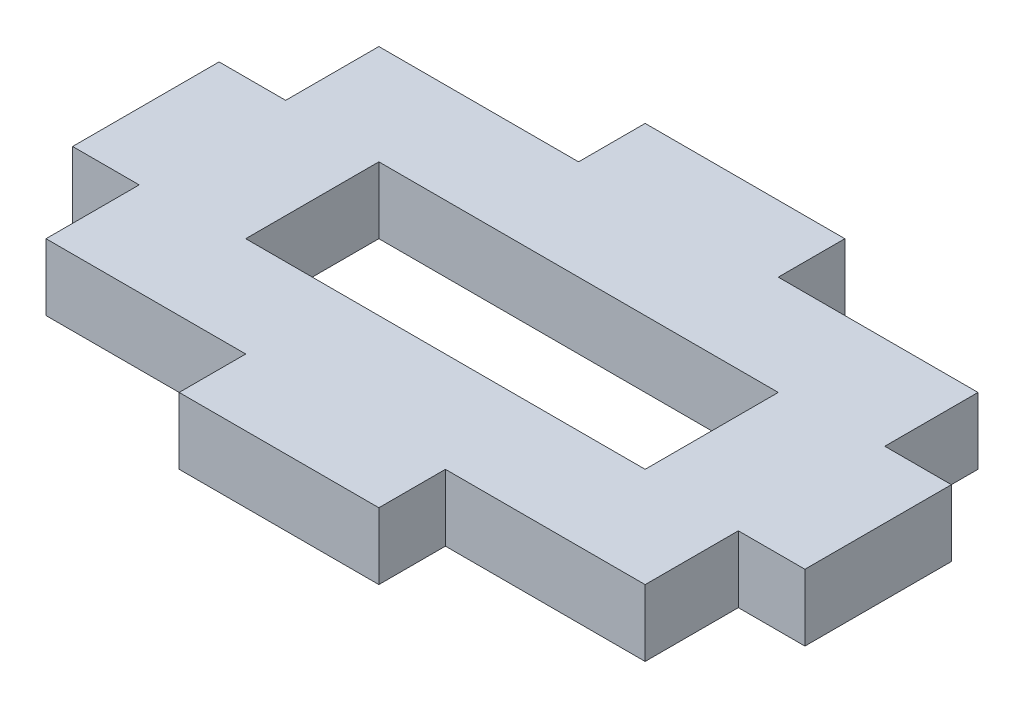
ISO-10303-21;
HEADER;
FILE_DESCRIPTION(('STEP AP214'),'2;1');
FILE_NAME('part.step','',(''),(''),'','','');
FILE_SCHEMA(('AUTOMOTIVE_DESIGN { 1 0 10303 214 1 1 1 1 }'));
ENDSEC;
DATA;
#1=APPLICATION_CONTEXT('core data for automotive mechanical design processes');
#2=APPLICATION_PROTOCOL_DEFINITION('international standard','automotive_design',2000,#1);
#3=PRODUCT_CONTEXT('',#1,'mechanical');
#4=PRODUCT('Part','Part','',(#3));
#5=PRODUCT_RELATED_PRODUCT_CATEGORY('part','',(#4));
#6=PRODUCT_DEFINITION_FORMATION('','',#4);
#7=PRODUCT_DEFINITION_CONTEXT('part definition',#1,'design');
#8=PRODUCT_DEFINITION('design','',#6,#7);
#9=PRODUCT_DEFINITION_SHAPE('','',#8);
#10=(LENGTH_UNIT() NAMED_UNIT(*) SI_UNIT(.MILLI.,.METRE.));
#11=(NAMED_UNIT(*) PLANE_ANGLE_UNIT() SI_UNIT($,.RADIAN.));
#12=(NAMED_UNIT(*) SI_UNIT($,.STERADIAN.) SOLID_ANGLE_UNIT());
#13=UNCERTAINTY_MEASURE_WITH_UNIT(LENGTH_MEASURE(1.E-05),#10,'distance_accuracy_value','');
#14=(GEOMETRIC_REPRESENTATION_CONTEXT(3) GLOBAL_UNCERTAINTY_ASSIGNED_CONTEXT((#13)) GLOBAL_UNIT_ASSIGNED_CONTEXT((#10,
#11,#12)) REPRESENTATION_CONTEXT('',''));
#15=CARTESIAN_POINT('',(0.,0.,0.));
#16=DIRECTION('',(0.,0.,1.));
#17=DIRECTION('',(1.,0.,0.));
#18=AXIS2_PLACEMENT_3D('',#15,#16,#17);
#19=CARTESIAN_POINT('',(0.,5.,0.));
#20=DIRECTION('',(0.,-1.,0.));
#21=DIRECTION('',(0.,0.,-1.));
#22=AXIS2_PLACEMENT_3D('',#19,#20,#21);
#23=PLANE('',#22);
#24=DIRECTION('',(0.,0.,-1.));
#25=VECTOR('',#24,1.);
#26=CARTESIAN_POINT('',(22.5,5.,-5.5));
#27=LINE('',#26,#25);
#28=CARTESIAN_POINT('',(22.5,5.,-5.5));
#29=VERTEX_POINT('',#28);
#30=CARTESIAN_POINT('',(22.5,5.,-12.5));
#31=VERTEX_POINT('',#30);
#32=EDGE_CURVE('E230',#29,#31,#27,.T.);
#33=ORIENTED_EDGE('',*,*,#32,.T.);
#34=DIRECTION('',(-1.,0.,0.));
#35=VECTOR('',#34,1.);
#36=CARTESIAN_POINT('',(7.5,5.,-12.5));
#37=LINE('',#36,#35);
#38=CARTESIAN_POINT('',(7.5,5.,-12.5));
#39=VERTEX_POINT('',#38);
#40=EDGE_CURVE('E233',#31,#39,#37,.T.);
#41=ORIENTED_EDGE('',*,*,#40,.T.);
#42=DIRECTION('',(0.,0.,-1.));
#43=VECTOR('',#42,1.);
#44=CARTESIAN_POINT('',(7.5,5.,-12.5));
#45=LINE('',#44,#43);
#46=CARTESIAN_POINT('',(7.50000000000001,5.,-17.5));
#47=VERTEX_POINT('',#46);
#48=EDGE_CURVE('E236',#39,#47,#45,.T.);
#49=ORIENTED_EDGE('',*,*,#48,.T.);
#50=DIRECTION('',(-1.,0.,0.));
#51=VECTOR('',#50,1.);
#52=CARTESIAN_POINT('',(-7.49999999999999,5.,-17.5));
#53=LINE('',#52,#51);
#54=CARTESIAN_POINT('',(-7.49999999999999,5.,-17.5));
#55=VERTEX_POINT('',#54);
#56=EDGE_CURVE('E238',#47,#55,#53,.T.);
#57=ORIENTED_EDGE('',*,*,#56,.T.);
#58=DIRECTION('',(0.,0.,1.));
#59=VECTOR('',#58,1.);
#60=CARTESIAN_POINT('',(-7.5,5.,-12.5));
#61=LINE('',#60,#59);
#62=CARTESIAN_POINT('',(-7.5,5.,-12.5));
#63=VERTEX_POINT('',#62);
#64=EDGE_CURVE('E240',#55,#63,#61,.T.);
#65=ORIENTED_EDGE('',*,*,#64,.T.);
#66=DIRECTION('',(-1.,0.,0.));
#67=VECTOR('',#66,1.);
#68=CARTESIAN_POINT('',(-22.5,5.,-12.5));
#69=LINE('',#68,#67);
#70=CARTESIAN_POINT('',(-22.5,5.,-12.5));
#71=VERTEX_POINT('',#70);
#72=EDGE_CURVE('E242',#63,#71,#69,.T.);
#73=ORIENTED_EDGE('',*,*,#72,.T.);
#74=DIRECTION('',(0.,0.,1.));
#75=VECTOR('',#74,1.);
#76=CARTESIAN_POINT('',(-22.5,5.,-5.5));
#77=LINE('',#76,#75);
#78=CARTESIAN_POINT('',(-22.5,5.,-5.5));
#79=VERTEX_POINT('',#78);
#80=EDGE_CURVE('E244',#71,#79,#77,.T.);
#81=ORIENTED_EDGE('',*,*,#80,.T.);
#82=DIRECTION('',(-1.,0.,0.));
#83=VECTOR('',#82,1.);
#84=CARTESIAN_POINT('',(-22.5,5.,-5.5));
#85=LINE('',#84,#83);
#86=CARTESIAN_POINT('',(-27.5,5.,-5.5));
#87=VERTEX_POINT('',#86);
#88=EDGE_CURVE('E246',#79,#87,#85,.T.);
#89=ORIENTED_EDGE('',*,*,#88,.T.);
#90=DIRECTION('',(0.,0.,1.));
#91=VECTOR('',#90,1.);
#92=CARTESIAN_POINT('',(-27.5,5.,-5.5));
#93=LINE('',#92,#91);
#94=CARTESIAN_POINT('',(-27.5,5.,5.5));
#95=VERTEX_POINT('',#94);
#96=EDGE_CURVE('E248',#87,#95,#93,.T.);
#97=ORIENTED_EDGE('',*,*,#96,.T.);
#98=DIRECTION('',(1.,0.,0.));
#99=VECTOR('',#98,1.);
#100=CARTESIAN_POINT('',(-22.5,5.,5.5));
#101=LINE('',#100,#99);
#102=CARTESIAN_POINT('',(-22.5,5.,5.5));
#103=VERTEX_POINT('',#102);
#104=EDGE_CURVE('E250',#95,#103,#101,.T.);
#105=ORIENTED_EDGE('',*,*,#104,.T.);
#106=DIRECTION('',(0.,0.,1.));
#107=VECTOR('',#106,1.);
#108=CARTESIAN_POINT('',(-22.5,5.,12.5));
#109=LINE('',#108,#107);
#110=CARTESIAN_POINT('',(-22.5,5.,12.5));
#111=VERTEX_POINT('',#110);
#112=EDGE_CURVE('E252',#103,#111,#109,.T.);
#113=ORIENTED_EDGE('',*,*,#112,.T.);
#114=DIRECTION('',(1.,0.,0.));
#115=VECTOR('',#114,1.);
#116=CARTESIAN_POINT('',(-22.5,5.,12.5));
#117=LINE('',#116,#115);
#118=CARTESIAN_POINT('',(-7.5,5.,12.5));
#119=VERTEX_POINT('',#118);
#120=EDGE_CURVE('E254',#111,#119,#117,.T.);
#121=ORIENTED_EDGE('',*,*,#120,.T.);
#122=DIRECTION('',(0.,0.,1.));
#123=VECTOR('',#122,1.);
#124=CARTESIAN_POINT('',(-7.5,5.,12.5));
#125=LINE('',#124,#123);
#126=CARTESIAN_POINT('',(-7.49999999999999,5.,17.5));
#127=VERTEX_POINT('',#126);
#128=EDGE_CURVE('E256',#119,#127,#125,.T.);
#129=ORIENTED_EDGE('',*,*,#128,.T.);
#130=DIRECTION('',(1.,0.,0.));
#131=VECTOR('',#130,1.);
#132=CARTESIAN_POINT('',(-7.49999999999999,5.,17.5));
#133=LINE('',#132,#131);
#134=CARTESIAN_POINT('',(7.50000000000001,5.,17.5));
#135=VERTEX_POINT('',#134);
#136=EDGE_CURVE('E258',#127,#135,#133,.T.);
#137=ORIENTED_EDGE('',*,*,#136,.T.);
#138=DIRECTION('',(0.,0.,-1.));
#139=VECTOR('',#138,1.);
#140=CARTESIAN_POINT('',(7.5,5.,12.5));
#141=LINE('',#140,#139);
#142=CARTESIAN_POINT('',(7.5,5.,12.5));
#143=VERTEX_POINT('',#142);
#144=EDGE_CURVE('E260',#135,#143,#141,.T.);
#145=ORIENTED_EDGE('',*,*,#144,.T.);
#146=DIRECTION('',(1.,0.,0.));
#147=VECTOR('',#146,1.);
#148=CARTESIAN_POINT('',(7.5,5.,12.5));
#149=LINE('',#148,#147);
#150=CARTESIAN_POINT('',(22.5,5.,12.5));
#151=VERTEX_POINT('',#150);
#152=EDGE_CURVE('E262',#143,#151,#149,.T.);
#153=ORIENTED_EDGE('',*,*,#152,.T.);
#154=DIRECTION('',(0.,0.,-1.));
#155=VECTOR('',#154,1.);
#156=CARTESIAN_POINT('',(22.5,5.,12.5));
#157=LINE('',#156,#155);
#158=CARTESIAN_POINT('',(22.5,5.,5.49999999999999));
#159=VERTEX_POINT('',#158);
#160=EDGE_CURVE('E264',#151,#159,#157,.T.);
#161=ORIENTED_EDGE('',*,*,#160,.T.);
#162=DIRECTION('',(1.,0.,0.));
#163=VECTOR('',#162,1.);
#164=CARTESIAN_POINT('',(22.5,5.,5.49999999999999));
#165=LINE('',#164,#163);
#166=CARTESIAN_POINT('',(27.5,5.,5.49999999999999));
#167=VERTEX_POINT('',#166);
#168=EDGE_CURVE('E266',#159,#167,#165,.T.);
#169=ORIENTED_EDGE('',*,*,#168,.T.);
#170=DIRECTION('',(0.,0.,-1.));
#171=VECTOR('',#170,1.);
#172=CARTESIAN_POINT('',(27.5,5.,-5.5));
#173=LINE('',#172,#171);
#174=CARTESIAN_POINT('',(27.5,5.,-5.5));
#175=VERTEX_POINT('',#174);
#176=EDGE_CURVE('E268',#167,#175,#173,.T.);
#177=ORIENTED_EDGE('',*,*,#176,.T.);
#178=DIRECTION('',(-1.,0.,0.));
#179=VECTOR('',#178,1.);
#180=CARTESIAN_POINT('',(22.5,5.,-5.5));
#181=LINE('',#180,#179);
#182=EDGE_CURVE('E270',#175,#29,#181,.T.);
#183=ORIENTED_EDGE('',*,*,#182,.T.);
#184=EDGE_LOOP('',(#33,#41,#49,#57,#65,#73,#81,#89,#97,#105,#113,#121,#129,#137,#145,#153,#161,
#169,#177,#183));
#185=FACE_BOUND('',#184,.T.);
#186=DIRECTION('',(0.,0.,-1.));
#187=VECTOR('',#186,1.);
#188=CARTESIAN_POINT('',(15.,5.,5.));
#189=LINE('',#188,#187);
#190=CARTESIAN_POINT('',(15.,5.,5.));
#191=VERTEX_POINT('',#190);
#192=CARTESIAN_POINT('',(15.,5.,-5.));
#193=VERTEX_POINT('',#192);
#194=EDGE_CURVE('E194',#191,#193,#189,.T.);
#195=ORIENTED_EDGE('',*,*,#194,.F.);
#196=DIRECTION('',(1.,0.,0.));
#197=VECTOR('',#196,1.);
#198=CARTESIAN_POINT('',(-15.,5.,5.));
#199=LINE('',#198,#197);
#200=CARTESIAN_POINT('',(-15.,5.,5.));
#201=VERTEX_POINT('',#200);
#202=EDGE_CURVE('E216',#201,#191,#199,.T.);
#203=ORIENTED_EDGE('',*,*,#202,.F.);
#204=DIRECTION('',(0.,0.,1.));
#205=VECTOR('',#204,1.);
#206=CARTESIAN_POINT('',(-15.,5.,5.));
#207=LINE('',#206,#205);
#208=CARTESIAN_POINT('',(-15.,5.,-5.));
#209=VERTEX_POINT('',#208);
#210=EDGE_CURVE('E214',#209,#201,#207,.T.);
#211=ORIENTED_EDGE('',*,*,#210,.F.);
#212=DIRECTION('',(-1.,0.,0.));
#213=VECTOR('',#212,1.);
#214=CARTESIAN_POINT('',(-15.,5.,-5.));
#215=LINE('',#214,#213);
#216=EDGE_CURVE('E202',#193,#209,#215,.T.);
#217=ORIENTED_EDGE('',*,*,#216,.F.);
#218=EDGE_LOOP('',(#195,#203,#211,#217));
#219=FACE_BOUND('',#218,.T.);
#220=ADVANCED_FACE('F33',(#185,#219),#23,.F.);
#221=CARTESIAN_POINT('',(0.,0.,0.));
#222=DIRECTION('',(0.,-1.,0.));
#223=DIRECTION('',(0.,0.,-1.));
#224=AXIS2_PLACEMENT_3D('',#221,#222,#223);
#225=PLANE('',#224);
#226=DIRECTION('',(0.,0.,-1.));
#227=VECTOR('',#226,1.);
#228=CARTESIAN_POINT('',(22.5,0.,-5.5));
#229=LINE('',#228,#227);
#230=CARTESIAN_POINT('',(22.5,0.,-5.5));
#231=VERTEX_POINT('',#230);
#232=CARTESIAN_POINT('',(22.5,0.,-12.5));
#233=VERTEX_POINT('',#232);
#234=EDGE_CURVE('E210',#231,#233,#229,.T.);
#235=ORIENTED_EDGE('',*,*,#234,.F.);
#236=DIRECTION('',(-1.,0.,0.));
#237=VECTOR('',#236,1.);
#238=CARTESIAN_POINT('',(22.5,0.,-5.5));
#239=LINE('',#238,#237);
#240=CARTESIAN_POINT('',(27.5,0.,-5.5));
#241=VERTEX_POINT('',#240);
#242=EDGE_CURVE('E234',#241,#231,#239,.T.);
#243=ORIENTED_EDGE('',*,*,#242,.F.);
#244=DIRECTION('',(0.,0.,-1.));
#245=VECTOR('',#244,1.);
#246=CARTESIAN_POINT('',(27.5,0.,-5.5));
#247=LINE('',#246,#245);
#248=CARTESIAN_POINT('',(27.5,0.,5.49999999999999));
#249=VERTEX_POINT('',#248);
#250=EDGE_CURVE('E309',#249,#241,#247,.T.);
#251=ORIENTED_EDGE('',*,*,#250,.F.);
#252=DIRECTION('',(1.,0.,0.));
#253=VECTOR('',#252,1.);
#254=CARTESIAN_POINT('',(22.5,0.,5.49999999999999));
#255=LINE('',#254,#253);
#256=CARTESIAN_POINT('',(22.5,0.,5.49999999999999));
#257=VERTEX_POINT('',#256);
#258=EDGE_CURVE('E307',#257,#249,#255,.T.);
#259=ORIENTED_EDGE('',*,*,#258,.F.);
#260=DIRECTION('',(0.,0.,-1.));
#261=VECTOR('',#260,1.);
#262=CARTESIAN_POINT('',(22.5,0.,12.5));
#263=LINE('',#262,#261);
#264=CARTESIAN_POINT('',(22.5,0.,12.5));
#265=VERTEX_POINT('',#264);
#266=EDGE_CURVE('E305',#265,#257,#263,.T.);
#267=ORIENTED_EDGE('',*,*,#266,.F.);
#268=DIRECTION('',(1.,0.,0.));
#269=VECTOR('',#268,1.);
#270=CARTESIAN_POINT('',(7.5,0.,12.5));
#271=LINE('',#270,#269);
#272=CARTESIAN_POINT('',(7.5,0.,12.5));
#273=VERTEX_POINT('',#272);
#274=EDGE_CURVE('E303',#273,#265,#271,.T.);
#275=ORIENTED_EDGE('',*,*,#274,.F.);
#276=DIRECTION('',(0.,0.,-1.));
#277=VECTOR('',#276,1.);
#278=CARTESIAN_POINT('',(7.5,0.,12.5));
#279=LINE('',#278,#277);
#280=CARTESIAN_POINT('',(7.50000000000001,0.,17.5));
#281=VERTEX_POINT('',#280);
#282=EDGE_CURVE('E301',#281,#273,#279,.T.);
#283=ORIENTED_EDGE('',*,*,#282,.F.);
#284=DIRECTION('',(1.,0.,0.));
#285=VECTOR('',#284,1.);
#286=CARTESIAN_POINT('',(-7.49999999999999,0.,17.5));
#287=LINE('',#286,#285);
#288=CARTESIAN_POINT('',(-7.49999999999999,0.,17.5));
#289=VERTEX_POINT('',#288);
#290=EDGE_CURVE('E299',#289,#281,#287,.T.);
#291=ORIENTED_EDGE('',*,*,#290,.F.);
#292=DIRECTION('',(0.,0.,1.));
#293=VECTOR('',#292,1.);
#294=CARTESIAN_POINT('',(-7.5,0.,12.5));
#295=LINE('',#294,#293);
#296=CARTESIAN_POINT('',(-7.5,0.,12.5));
#297=VERTEX_POINT('',#296);
#298=EDGE_CURVE('E297',#297,#289,#295,.T.);
#299=ORIENTED_EDGE('',*,*,#298,.F.);
#300=DIRECTION('',(1.,0.,0.));
#301=VECTOR('',#300,1.);
#302=CARTESIAN_POINT('',(-22.5,0.,12.5));
#303=LINE('',#302,#301);
#304=CARTESIAN_POINT('',(-22.5,0.,12.5));
#305=VERTEX_POINT('',#304);
#306=EDGE_CURVE('E295',#305,#297,#303,.T.);
#307=ORIENTED_EDGE('',*,*,#306,.F.);
#308=DIRECTION('',(0.,0.,1.));
#309=VECTOR('',#308,1.);
#310=CARTESIAN_POINT('',(-22.5,0.,12.5));
#311=LINE('',#310,#309);
#312=CARTESIAN_POINT('',(-22.5,0.,5.5));
#313=VERTEX_POINT('',#312);
#314=EDGE_CURVE('E293',#313,#305,#311,.T.);
#315=ORIENTED_EDGE('',*,*,#314,.F.);
#316=DIRECTION('',(1.,0.,0.));
#317=VECTOR('',#316,1.);
#318=CARTESIAN_POINT('',(-22.5,0.,5.5));
#319=LINE('',#318,#317);
#320=CARTESIAN_POINT('',(-27.5,0.,5.5));
#321=VERTEX_POINT('',#320);
#322=EDGE_CURVE('E291',#321,#313,#319,.T.);
#323=ORIENTED_EDGE('',*,*,#322,.F.);
#324=DIRECTION('',(0.,0.,1.));
#325=VECTOR('',#324,1.);
#326=CARTESIAN_POINT('',(-27.5,0.,-5.5));
#327=LINE('',#326,#325);
#328=CARTESIAN_POINT('',(-27.5,0.,-5.5));
#329=VERTEX_POINT('',#328);
#330=EDGE_CURVE('E289',#329,#321,#327,.T.);
#331=ORIENTED_EDGE('',*,*,#330,.F.);
#332=DIRECTION('',(-1.,0.,0.));
#333=VECTOR('',#332,1.);
#334=CARTESIAN_POINT('',(-22.5,0.,-5.5));
#335=LINE('',#334,#333);
#336=CARTESIAN_POINT('',(-22.5,0.,-5.5));
#337=VERTEX_POINT('',#336);
#338=EDGE_CURVE('E287',#337,#329,#335,.T.);
#339=ORIENTED_EDGE('',*,*,#338,.F.);
#340=DIRECTION('',(0.,0.,1.));
#341=VECTOR('',#340,1.);
#342=CARTESIAN_POINT('',(-22.5,0.,-5.5));
#343=LINE('',#342,#341);
#344=CARTESIAN_POINT('',(-22.5,0.,-12.5));
#345=VERTEX_POINT('',#344);
#346=EDGE_CURVE('E285',#345,#337,#343,.T.);
#347=ORIENTED_EDGE('',*,*,#346,.F.);
#348=DIRECTION('',(-1.,0.,0.));
#349=VECTOR('',#348,1.);
#350=CARTESIAN_POINT('',(-22.5,0.,-12.5));
#351=LINE('',#350,#349);
#352=CARTESIAN_POINT('',(-7.5,0.,-12.5));
#353=VERTEX_POINT('',#352);
#354=EDGE_CURVE('E283',#353,#345,#351,.T.);
#355=ORIENTED_EDGE('',*,*,#354,.F.);
#356=DIRECTION('',(0.,0.,1.));
#357=VECTOR('',#356,1.);
#358=CARTESIAN_POINT('',(-7.5,0.,-12.5));
#359=LINE('',#358,#357);
#360=CARTESIAN_POINT('',(-7.49999999999999,0.,-17.5));
#361=VERTEX_POINT('',#360);
#362=EDGE_CURVE('E281',#361,#353,#359,.T.);
#363=ORIENTED_EDGE('',*,*,#362,.F.);
#364=DIRECTION('',(-1.,0.,0.));
#365=VECTOR('',#364,1.);
#366=CARTESIAN_POINT('',(-7.49999999999999,0.,-17.5));
#367=LINE('',#366,#365);
#368=CARTESIAN_POINT('',(7.50000000000001,0.,-17.5));
#369=VERTEX_POINT('',#368);
#370=EDGE_CURVE('E279',#369,#361,#367,.T.);
#371=ORIENTED_EDGE('',*,*,#370,.F.);
#372=DIRECTION('',(0.,0.,-1.));
#373=VECTOR('',#372,1.);
#374=CARTESIAN_POINT('',(7.5,0.,-12.5));
#375=LINE('',#374,#373);
#376=CARTESIAN_POINT('',(7.5,0.,-12.5));
#377=VERTEX_POINT('',#376);
#378=EDGE_CURVE('E277',#377,#369,#375,.T.);
#379=ORIENTED_EDGE('',*,*,#378,.F.);
#380=DIRECTION('',(-1.,0.,0.));
#381=VECTOR('',#380,1.);
#382=CARTESIAN_POINT('',(7.5,0.,-12.5));
#383=LINE('',#382,#381);
#384=EDGE_CURVE('E275',#233,#377,#383,.T.);
#385=ORIENTED_EDGE('',*,*,#384,.F.);
#386=EDGE_LOOP('',(#235,#243,#251,#259,#267,#275,#283,#291,#299,#307,#315,#323,#331,#339,#347,
#355,#363,#371,#379,#385));
#387=FACE_BOUND('',#386,.T.);
#388=DIRECTION('',(1.,0.,0.));
#389=VECTOR('',#388,1.);
#390=CARTESIAN_POINT('',(-15.,0.,5.));
#391=LINE('',#390,#389);
#392=CARTESIAN_POINT('',(-15.,0.,5.));
#393=VERTEX_POINT('',#392);
#394=CARTESIAN_POINT('',(15.,0.,5.));
#395=VERTEX_POINT('',#394);
#396=EDGE_CURVE('E203',#393,#395,#391,.T.);
#397=ORIENTED_EDGE('',*,*,#396,.T.);
#398=DIRECTION('',(0.,0.,-1.));
#399=VECTOR('',#398,1.);
#400=CARTESIAN_POINT('',(15.,0.,5.));
#401=LINE('',#400,#399);
#402=CARTESIAN_POINT('',(15.,0.,-5.));
#403=VERTEX_POINT('',#402);
#404=EDGE_CURVE('E56',#395,#403,#401,.T.);
#405=ORIENTED_EDGE('',*,*,#404,.T.);
#406=DIRECTION('',(-1.,0.,0.));
#407=VECTOR('',#406,1.);
#408=CARTESIAN_POINT('',(-15.,0.,-5.));
#409=LINE('',#408,#407);
#410=CARTESIAN_POINT('',(-15.,0.,-5.));
#411=VERTEX_POINT('',#410);
#412=EDGE_CURVE('E209',#403,#411,#409,.T.);
#413=ORIENTED_EDGE('',*,*,#412,.T.);
#414=DIRECTION('',(0.,0.,1.));
#415=VECTOR('',#414,1.);
#416=CARTESIAN_POINT('',(-15.,0.,5.));
#417=LINE('',#416,#415);
#418=EDGE_CURVE('E222',#411,#393,#417,.T.);
#419=ORIENTED_EDGE('',*,*,#418,.T.);
#420=EDGE_LOOP('',(#397,#405,#413,#419));
#421=FACE_BOUND('',#420,.T.);
#422=ADVANCED_FACE('F375',(#387,#421),#225,.T.);
#423=CARTESIAN_POINT('',(22.5,5.,-5.5));
#424=DIRECTION('',(-1.,0.,0.));
#425=DIRECTION('',(0.,0.,1.));
#426=AXIS2_PLACEMENT_3D('',#423,#424,#425);
#427=PLANE('',#426);
#428=ORIENTED_EDGE('',*,*,#234,.T.);
#429=DIRECTION('',(0.,-1.,0.));
#430=VECTOR('',#429,1.);
#431=CARTESIAN_POINT('',(22.5,5.,-12.5));
#432=LINE('',#431,#430);
#433=EDGE_CURVE('E11',#31,#233,#432,.T.);
#434=ORIENTED_EDGE('',*,*,#433,.F.);
#435=ORIENTED_EDGE('',*,*,#32,.F.);
#436=DIRECTION('',(0.,-1.,0.));
#437=VECTOR('',#436,1.);
#438=CARTESIAN_POINT('',(22.5,5.,-5.5));
#439=LINE('',#438,#437);
#440=EDGE_CURVE('E272',#29,#231,#439,.T.);
#441=ORIENTED_EDGE('',*,*,#440,.T.);
#442=EDGE_LOOP('',(#428,#434,#435,#441));
#443=FACE_BOUND('',#442,.T.);
#444=ADVANCED_FACE('F35',(#443),#427,.F.);
#445=CARTESIAN_POINT('',(7.5,5.,-12.5));
#446=DIRECTION('',(0.,0.,1.));
#447=DIRECTION('',(1.,0.,0.));
#448=AXIS2_PLACEMENT_3D('',#445,#446,#447);
#449=PLANE('',#448);
#450=ORIENTED_EDGE('',*,*,#384,.T.);
#451=DIRECTION('',(0.,-1.,0.));
#452=VECTOR('',#451,1.);
#453=CARTESIAN_POINT('',(7.5,5.,-12.5));
#454=LINE('',#453,#452);
#455=EDGE_CURVE('E41',#39,#377,#454,.T.);
#456=ORIENTED_EDGE('',*,*,#455,.F.);
#457=ORIENTED_EDGE('',*,*,#40,.F.);
#458=ORIENTED_EDGE('',*,*,#433,.T.);
#459=EDGE_LOOP('',(#450,#456,#457,#458));
#460=FACE_BOUND('',#459,.T.);
#461=ADVANCED_FACE('F392',(#460),#449,.F.);
#462=CARTESIAN_POINT('',(7.5,5.,-12.5));
#463=DIRECTION('',(-1.,0.,0.));
#464=DIRECTION('',(0.,0.,1.));
#465=AXIS2_PLACEMENT_3D('',#462,#463,#464);
#466=PLANE('',#465);
#467=ORIENTED_EDGE('',*,*,#378,.T.);
#468=DIRECTION('',(0.,-1.,0.));
#469=VECTOR('',#468,1.);
#470=CARTESIAN_POINT('',(7.50000000000001,5.,-17.5));
#471=LINE('',#470,#469);
#472=EDGE_CURVE('E362',#47,#369,#471,.T.);
#473=ORIENTED_EDGE('',*,*,#472,.F.);
#474=ORIENTED_EDGE('',*,*,#48,.F.);
#475=ORIENTED_EDGE('',*,*,#455,.T.);
#476=EDGE_LOOP('',(#467,#473,#474,#475));
#477=FACE_BOUND('',#476,.T.);
#478=ADVANCED_FACE('F369',(#477),#466,.F.);
#479=CARTESIAN_POINT('',(-7.49999999999999,5.,-17.5));
#480=DIRECTION('',(0.,0.,1.));
#481=DIRECTION('',(1.,0.,0.));
#482=AXIS2_PLACEMENT_3D('',#479,#480,#481);
#483=PLANE('',#482);
#484=ORIENTED_EDGE('',*,*,#370,.T.);
#485=DIRECTION('',(0.,-1.,0.));
#486=VECTOR('',#485,1.);
#487=CARTESIAN_POINT('',(-7.49999999999999,5.,-17.5));
#488=LINE('',#487,#486);
#489=EDGE_CURVE('E359',#55,#361,#488,.T.);
#490=ORIENTED_EDGE('',*,*,#489,.F.);
#491=ORIENTED_EDGE('',*,*,#56,.F.);
#492=ORIENTED_EDGE('',*,*,#472,.T.);
#493=EDGE_LOOP('',(#484,#490,#491,#492));
#494=FACE_BOUND('',#493,.T.);
#495=ADVANCED_FACE('F381',(#494),#483,.F.);
#496=CARTESIAN_POINT('',(-7.5,5.,-12.5));
#497=DIRECTION('',(1.,0.,0.));
#498=DIRECTION('',(0.,0.,-1.));
#499=AXIS2_PLACEMENT_3D('',#496,#497,#498);
#500=PLANE('',#499);
#501=ORIENTED_EDGE('',*,*,#362,.T.);
#502=DIRECTION('',(0.,-1.,0.));
#503=VECTOR('',#502,1.);
#504=CARTESIAN_POINT('',(-7.5,5.,-12.5));
#505=LINE('',#504,#503);
#506=EDGE_CURVE('E356',#63,#353,#505,.T.);
#507=ORIENTED_EDGE('',*,*,#506,.F.);
#508=ORIENTED_EDGE('',*,*,#64,.F.);
#509=ORIENTED_EDGE('',*,*,#489,.T.);
#510=EDGE_LOOP('',(#501,#507,#508,#509));
#511=FACE_BOUND('',#510,.T.);
#512=ADVANCED_FACE('F385',(#511),#500,.F.);
#513=CARTESIAN_POINT('',(-22.5,5.,-12.5));
#514=DIRECTION('',(0.,0.,1.));
#515=DIRECTION('',(1.,0.,0.));
#516=AXIS2_PLACEMENT_3D('',#513,#514,#515);
#517=PLANE('',#516);
#518=ORIENTED_EDGE('',*,*,#354,.T.);
#519=DIRECTION('',(0.,-1.,0.));
#520=VECTOR('',#519,1.);
#521=CARTESIAN_POINT('',(-22.5,5.,-12.5));
#522=LINE('',#521,#520);
#523=EDGE_CURVE('E353',#71,#345,#522,.T.);
#524=ORIENTED_EDGE('',*,*,#523,.F.);
#525=ORIENTED_EDGE('',*,*,#72,.F.);
#526=ORIENTED_EDGE('',*,*,#506,.T.);
#527=EDGE_LOOP('',(#518,#524,#525,#526));
#528=FACE_BOUND('',#527,.T.);
#529=ADVANCED_FACE('F465',(#528),#517,.F.);
#530=CARTESIAN_POINT('',(-22.5,5.,-5.5));
#531=DIRECTION('',(1.,0.,0.));
#532=DIRECTION('',(0.,0.,-1.));
#533=AXIS2_PLACEMENT_3D('',#530,#531,#532);
#534=PLANE('',#533);
#535=ORIENTED_EDGE('',*,*,#346,.T.);
#536=DIRECTION('',(0.,-1.,0.));
#537=VECTOR('',#536,1.);
#538=CARTESIAN_POINT('',(-22.5,5.,-5.5));
#539=LINE('',#538,#537);
#540=EDGE_CURVE('E350',#79,#337,#539,.T.);
#541=ORIENTED_EDGE('',*,*,#540,.F.);
#542=ORIENTED_EDGE('',*,*,#80,.F.);
#543=ORIENTED_EDGE('',*,*,#523,.T.);
#544=EDGE_LOOP('',(#535,#541,#542,#543));
#545=FACE_BOUND('',#544,.T.);
#546=ADVANCED_FACE('F463',(#545),#534,.F.);
#547=CARTESIAN_POINT('',(-22.5,5.,-5.5));
#548=DIRECTION('',(0.,0.,1.));
#549=DIRECTION('',(1.,0.,0.));
#550=AXIS2_PLACEMENT_3D('',#547,#548,#549);
#551=PLANE('',#550);
#552=ORIENTED_EDGE('',*,*,#338,.T.);
#553=DIRECTION('',(0.,-1.,0.));
#554=VECTOR('',#553,1.);
#555=CARTESIAN_POINT('',(-27.5,5.,-5.5));
#556=LINE('',#555,#554);
#557=EDGE_CURVE('E347',#87,#329,#556,.T.);
#558=ORIENTED_EDGE('',*,*,#557,.F.);
#559=ORIENTED_EDGE('',*,*,#88,.F.);
#560=ORIENTED_EDGE('',*,*,#540,.T.);
#561=EDGE_LOOP('',(#552,#558,#559,#560));
#562=FACE_BOUND('',#561,.T.);
#563=ADVANCED_FACE('F458',(#562),#551,.F.);
#564=CARTESIAN_POINT('',(-27.5,5.,-5.5));
#565=DIRECTION('',(1.,0.,0.));
#566=DIRECTION('',(0.,0.,-1.));
#567=AXIS2_PLACEMENT_3D('',#564,#565,#566);
#568=PLANE('',#567);
#569=ORIENTED_EDGE('',*,*,#330,.T.);
#570=DIRECTION('',(0.,-1.,0.));
#571=VECTOR('',#570,1.);
#572=CARTESIAN_POINT('',(-27.5,5.,5.5));
#573=LINE('',#572,#571);
#574=EDGE_CURVE('E344',#95,#321,#573,.T.);
#575=ORIENTED_EDGE('',*,*,#574,.F.);
#576=ORIENTED_EDGE('',*,*,#96,.F.);
#577=ORIENTED_EDGE('',*,*,#557,.T.);
#578=EDGE_LOOP('',(#569,#575,#576,#577));
#579=FACE_BOUND('',#578,.T.);
#580=ADVANCED_FACE('F453',(#579),#568,.F.);
#581=CARTESIAN_POINT('',(-22.5,5.,5.5));
#582=DIRECTION('',(0.,0.,-1.));
#583=DIRECTION('',(-1.,0.,0.));
#584=AXIS2_PLACEMENT_3D('',#581,#582,#583);
#585=PLANE('',#584);
#586=ORIENTED_EDGE('',*,*,#322,.T.);
#587=DIRECTION('',(0.,-1.,0.));
#588=VECTOR('',#587,1.);
#589=CARTESIAN_POINT('',(-22.5,5.,5.5));
#590=LINE('',#589,#588);
#591=EDGE_CURVE('E341',#103,#313,#590,.T.);
#592=ORIENTED_EDGE('',*,*,#591,.F.);
#593=ORIENTED_EDGE('',*,*,#104,.F.);
#594=ORIENTED_EDGE('',*,*,#574,.T.);
#595=EDGE_LOOP('',(#586,#592,#593,#594));
#596=FACE_BOUND('',#595,.T.);
#597=ADVANCED_FACE('F449',(#596),#585,.F.);
#598=CARTESIAN_POINT('',(-22.5,5.,12.5));
#599=DIRECTION('',(1.,0.,0.));
#600=DIRECTION('',(0.,0.,-1.));
#601=AXIS2_PLACEMENT_3D('',#598,#599,#600);
#602=PLANE('',#601);
#603=ORIENTED_EDGE('',*,*,#314,.T.);
#604=DIRECTION('',(0.,-1.,0.));
#605=VECTOR('',#604,1.);
#606=CARTESIAN_POINT('',(-22.5,5.,12.5));
#607=LINE('',#606,#605);
#608=EDGE_CURVE('E338',#111,#305,#607,.T.);
#609=ORIENTED_EDGE('',*,*,#608,.F.);
#610=ORIENTED_EDGE('',*,*,#112,.F.);
#611=ORIENTED_EDGE('',*,*,#591,.T.);
#612=EDGE_LOOP('',(#603,#609,#610,#611));
#613=FACE_BOUND('',#612,.T.);
#614=ADVANCED_FACE('F444',(#613),#602,.F.);
#615=CARTESIAN_POINT('',(-22.5,5.,12.5));
#616=DIRECTION('',(0.,0.,-1.));
#617=DIRECTION('',(-1.,0.,0.));
#618=AXIS2_PLACEMENT_3D('',#615,#616,#617);
#619=PLANE('',#618);
#620=ORIENTED_EDGE('',*,*,#306,.T.);
#621=DIRECTION('',(0.,-1.,0.));
#622=VECTOR('',#621,1.);
#623=CARTESIAN_POINT('',(-7.5,5.,12.5));
#624=LINE('',#623,#622);
#625=EDGE_CURVE('E335',#119,#297,#624,.T.);
#626=ORIENTED_EDGE('',*,*,#625,.F.);
#627=ORIENTED_EDGE('',*,*,#120,.F.);
#628=ORIENTED_EDGE('',*,*,#608,.T.);
#629=EDGE_LOOP('',(#620,#626,#627,#628));
#630=FACE_BOUND('',#629,.T.);
#631=ADVANCED_FACE('F438',(#630),#619,.F.);
#632=CARTESIAN_POINT('',(-7.5,5.,12.5));
#633=DIRECTION('',(1.,0.,0.));
#634=DIRECTION('',(0.,0.,-1.));
#635=AXIS2_PLACEMENT_3D('',#632,#633,#634);
#636=PLANE('',#635);
#637=ORIENTED_EDGE('',*,*,#298,.T.);
#638=DIRECTION('',(0.,-1.,0.));
#639=VECTOR('',#638,1.);
#640=CARTESIAN_POINT('',(-7.49999999999999,5.,17.5));
#641=LINE('',#640,#639);
#642=EDGE_CURVE('E332',#127,#289,#641,.T.);
#643=ORIENTED_EDGE('',*,*,#642,.F.);
#644=ORIENTED_EDGE('',*,*,#128,.F.);
#645=ORIENTED_EDGE('',*,*,#625,.T.);
#646=EDGE_LOOP('',(#637,#643,#644,#645));
#647=FACE_BOUND('',#646,.T.);
#648=ADVANCED_FACE('F434',(#647),#636,.F.);
#649=CARTESIAN_POINT('',(-7.49999999999999,5.,17.5));
#650=DIRECTION('',(0.,0.,-1.));
#651=DIRECTION('',(-1.,0.,0.));
#652=AXIS2_PLACEMENT_3D('',#649,#650,#651);
#653=PLANE('',#652);
#654=ORIENTED_EDGE('',*,*,#290,.T.);
#655=DIRECTION('',(0.,-1.,0.));
#656=VECTOR('',#655,1.);
#657=CARTESIAN_POINT('',(7.50000000000001,5.,17.5));
#658=LINE('',#657,#656);
#659=EDGE_CURVE('E329',#135,#281,#658,.T.);
#660=ORIENTED_EDGE('',*,*,#659,.F.);
#661=ORIENTED_EDGE('',*,*,#136,.F.);
#662=ORIENTED_EDGE('',*,*,#642,.T.);
#663=EDGE_LOOP('',(#654,#660,#661,#662));
#664=FACE_BOUND('',#663,.T.);
#665=ADVANCED_FACE('F429',(#664),#653,.F.);
#666=CARTESIAN_POINT('',(7.5,5.,12.5));
#667=DIRECTION('',(-1.,0.,0.));
#668=DIRECTION('',(0.,0.,1.));
#669=AXIS2_PLACEMENT_3D('',#666,#667,#668);
#670=PLANE('',#669);
#671=ORIENTED_EDGE('',*,*,#282,.T.);
#672=DIRECTION('',(0.,-1.,0.));
#673=VECTOR('',#672,1.);
#674=CARTESIAN_POINT('',(7.5,5.,12.5));
#675=LINE('',#674,#673);
#676=EDGE_CURVE('E326',#143,#273,#675,.T.);
#677=ORIENTED_EDGE('',*,*,#676,.F.);
#678=ORIENTED_EDGE('',*,*,#144,.F.);
#679=ORIENTED_EDGE('',*,*,#659,.T.);
#680=EDGE_LOOP('',(#671,#677,#678,#679));
#681=FACE_BOUND('',#680,.T.);
#682=ADVANCED_FACE('F423',(#681),#670,.F.);
#683=CARTESIAN_POINT('',(7.5,5.,12.5));
#684=DIRECTION('',(0.,0.,-1.));
#685=DIRECTION('',(-1.,0.,0.));
#686=AXIS2_PLACEMENT_3D('',#683,#684,#685);
#687=PLANE('',#686);
#688=ORIENTED_EDGE('',*,*,#274,.T.);
#689=DIRECTION('',(0.,-1.,0.));
#690=VECTOR('',#689,1.);
#691=CARTESIAN_POINT('',(22.5,5.,12.5));
#692=LINE('',#691,#690);
#693=EDGE_CURVE('E323',#151,#265,#692,.T.);
#694=ORIENTED_EDGE('',*,*,#693,.F.);
#695=ORIENTED_EDGE('',*,*,#152,.F.);
#696=ORIENTED_EDGE('',*,*,#676,.T.);
#697=EDGE_LOOP('',(#688,#694,#695,#696));
#698=FACE_BOUND('',#697,.T.);
#699=ADVANCED_FACE('F419',(#698),#687,.F.);
#700=CARTESIAN_POINT('',(22.5,5.,12.5));
#701=DIRECTION('',(-1.,0.,0.));
#702=DIRECTION('',(0.,0.,1.));
#703=AXIS2_PLACEMENT_3D('',#700,#701,#702);
#704=PLANE('',#703);
#705=ORIENTED_EDGE('',*,*,#266,.T.);
#706=DIRECTION('',(0.,-1.,0.));
#707=VECTOR('',#706,1.);
#708=CARTESIAN_POINT('',(22.5,5.,5.49999999999999));
#709=LINE('',#708,#707);
#710=EDGE_CURVE('E320',#159,#257,#709,.T.);
#711=ORIENTED_EDGE('',*,*,#710,.F.);
#712=ORIENTED_EDGE('',*,*,#160,.F.);
#713=ORIENTED_EDGE('',*,*,#693,.T.);
#714=EDGE_LOOP('',(#705,#711,#712,#713));
#715=FACE_BOUND('',#714,.T.);
#716=ADVANCED_FACE('F414',(#715),#704,.F.);
#717=CARTESIAN_POINT('',(22.5,5.,5.49999999999999));
#718=DIRECTION('',(0.,0.,-1.));
#719=DIRECTION('',(-1.,0.,0.));
#720=AXIS2_PLACEMENT_3D('',#717,#718,#719);
#721=PLANE('',#720);
#722=ORIENTED_EDGE('',*,*,#258,.T.);
#723=DIRECTION('',(0.,-1.,0.));
#724=VECTOR('',#723,1.);
#725=CARTESIAN_POINT('',(27.5,5.,5.49999999999999));
#726=LINE('',#725,#724);
#727=EDGE_CURVE('E317',#167,#249,#726,.T.);
#728=ORIENTED_EDGE('',*,*,#727,.F.);
#729=ORIENTED_EDGE('',*,*,#168,.F.);
#730=ORIENTED_EDGE('',*,*,#710,.T.);
#731=EDGE_LOOP('',(#722,#728,#729,#730));
#732=FACE_BOUND('',#731,.T.);
#733=ADVANCED_FACE('F408',(#732),#721,.F.);
#734=CARTESIAN_POINT('',(27.5,5.,-5.5));
#735=DIRECTION('',(-1.,0.,0.));
#736=DIRECTION('',(0.,0.,1.));
#737=AXIS2_PLACEMENT_3D('',#734,#735,#736);
#738=PLANE('',#737);
#739=ORIENTED_EDGE('',*,*,#250,.T.);
#740=DIRECTION('',(0.,-1.,0.));
#741=VECTOR('',#740,1.);
#742=CARTESIAN_POINT('',(27.5,5.,-5.5));
#743=LINE('',#742,#741);
#744=EDGE_CURVE('E314',#175,#241,#743,.T.);
#745=ORIENTED_EDGE('',*,*,#744,.F.);
#746=ORIENTED_EDGE('',*,*,#176,.F.);
#747=ORIENTED_EDGE('',*,*,#727,.T.);
#748=EDGE_LOOP('',(#739,#745,#746,#747));
#749=FACE_BOUND('',#748,.T.);
#750=ADVANCED_FACE('F404',(#749),#738,.F.);
#751=CARTESIAN_POINT('',(22.5,5.,-5.5));
#752=DIRECTION('',(0.,0.,1.));
#753=DIRECTION('',(1.,0.,0.));
#754=AXIS2_PLACEMENT_3D('',#751,#752,#753);
#755=PLANE('',#754);
#756=ORIENTED_EDGE('',*,*,#242,.T.);
#757=ORIENTED_EDGE('',*,*,#440,.F.);
#758=ORIENTED_EDGE('',*,*,#182,.F.);
#759=ORIENTED_EDGE('',*,*,#744,.T.);
#760=EDGE_LOOP('',(#756,#757,#758,#759));
#761=FACE_BOUND('',#760,.T.);
#762=ADVANCED_FACE('F399',(#761),#755,.F.);
#763=CARTESIAN_POINT('',(15.,5.,5.));
#764=DIRECTION('',(-1.,0.,0.));
#765=DIRECTION('',(0.,0.,1.));
#766=AXIS2_PLACEMENT_3D('',#763,#764,#765);
#767=PLANE('',#766);
#768=ORIENTED_EDGE('',*,*,#404,.F.);
#769=DIRECTION('',(0.,-1.,0.));
#770=VECTOR('',#769,1.);
#771=CARTESIAN_POINT('',(15.,5.,5.));
#772=LINE('',#771,#770);
#773=EDGE_CURVE('E198',#191,#395,#772,.T.);
#774=ORIENTED_EDGE('',*,*,#773,.F.);
#775=ORIENTED_EDGE('',*,*,#194,.T.);
#776=DIRECTION('',(0.,-1.,0.));
#777=VECTOR('',#776,1.);
#778=CARTESIAN_POINT('',(15.,5.,-5.));
#779=LINE('',#778,#777);
#780=EDGE_CURVE('E197',#193,#403,#779,.T.);
#781=ORIENTED_EDGE('',*,*,#780,.T.);
#782=EDGE_LOOP('',(#768,#774,#775,#781));
#783=FACE_BOUND('',#782,.T.);
#784=ADVANCED_FACE('F196',(#783),#767,.T.);
#785=CARTESIAN_POINT('',(-15.,5.,-5.));
#786=DIRECTION('',(0.,0.,1.));
#787=DIRECTION('',(1.,0.,0.));
#788=AXIS2_PLACEMENT_3D('',#785,#786,#787);
#789=PLANE('',#788);
#790=ORIENTED_EDGE('',*,*,#412,.F.);
#791=ORIENTED_EDGE('',*,*,#780,.F.);
#792=ORIENTED_EDGE('',*,*,#216,.T.);
#793=DIRECTION('',(0.,-1.,0.));
#794=VECTOR('',#793,1.);
#795=CARTESIAN_POINT('',(-15.,5.,-5.));
#796=LINE('',#795,#794);
#797=EDGE_CURVE('E211',#209,#411,#796,.T.);
#798=ORIENTED_EDGE('',*,*,#797,.T.);
#799=EDGE_LOOP('',(#790,#791,#792,#798));
#800=FACE_BOUND('',#799,.T.);
#801=ADVANCED_FACE('F206',(#800),#789,.T.);
#802=CARTESIAN_POINT('',(-15.,5.,5.));
#803=DIRECTION('',(1.,0.,0.));
#804=DIRECTION('',(0.,0.,-1.));
#805=AXIS2_PLACEMENT_3D('',#802,#803,#804);
#806=PLANE('',#805);
#807=ORIENTED_EDGE('',*,*,#418,.F.);
#808=ORIENTED_EDGE('',*,*,#797,.F.);
#809=ORIENTED_EDGE('',*,*,#210,.T.);
#810=DIRECTION('',(0.,-1.,0.));
#811=VECTOR('',#810,1.);
#812=CARTESIAN_POINT('',(-15.,5.,5.));
#813=LINE('',#812,#811);
#814=EDGE_CURVE('E48',#201,#393,#813,.T.);
#815=ORIENTED_EDGE('',*,*,#814,.T.);
#816=EDGE_LOOP('',(#807,#808,#809,#815));
#817=FACE_BOUND('',#816,.T.);
#818=ADVANCED_FACE('F571',(#817),#806,.T.);
#819=CARTESIAN_POINT('',(-15.,5.,5.));
#820=DIRECTION('',(0.,0.,-1.));
#821=DIRECTION('',(-1.,0.,0.));
#822=AXIS2_PLACEMENT_3D('',#819,#820,#821);
#823=PLANE('',#822);
#824=ORIENTED_EDGE('',*,*,#396,.F.);
#825=ORIENTED_EDGE('',*,*,#814,.F.);
#826=ORIENTED_EDGE('',*,*,#202,.T.);
#827=ORIENTED_EDGE('',*,*,#773,.T.);
#828=EDGE_LOOP('',(#824,#825,#826,#827));
#829=FACE_BOUND('',#828,.T.);
#830=ADVANCED_FACE('F577',(#829),#823,.T.);
#831=CLOSED_SHELL('',(#220,#422,#444,#461,#478,#495,#512,#529,#546,#563,#580,#597,#614,#631,
#648,#665,#682,#699,#716,#733,#750,#762,#784,#801,#818,#830));
#832=MANIFOLD_SOLID_BREP('B2',#831);
#833=ADVANCED_BREP_SHAPE_REPRESENTATION('',(#18,#832),#14);
#834=SHAPE_DEFINITION_REPRESENTATION(#9,#833);
ENDSEC;
END-ISO-10303-21;
